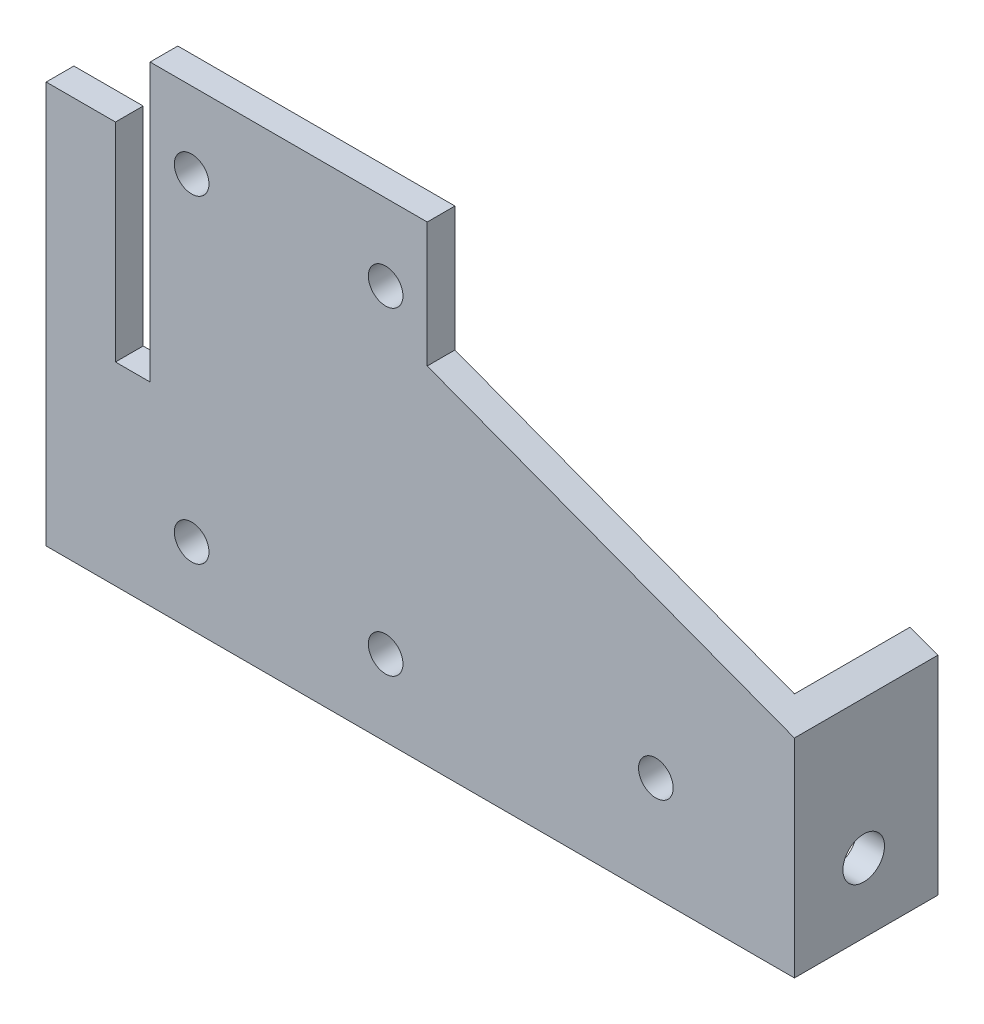
ISO-10303-21;
HEADER;
FILE_DESCRIPTION(('STEP AP214'),'2;1');
FILE_NAME('part.step','',(''),(''),'','','');
FILE_SCHEMA(('AUTOMOTIVE_DESIGN { 1 0 10303 214 1 1 1 1 }'));
ENDSEC;
DATA;
#1=APPLICATION_CONTEXT('core data for automotive mechanical design processes');
#2=APPLICATION_PROTOCOL_DEFINITION('international standard','automotive_design',2000,#1);
#3=PRODUCT_CONTEXT('',#1,'mechanical');
#4=PRODUCT('Part','Part','',(#3));
#5=PRODUCT_RELATED_PRODUCT_CATEGORY('part','',(#4));
#6=PRODUCT_DEFINITION_FORMATION('','',#4);
#7=PRODUCT_DEFINITION_CONTEXT('part definition',#1,'design');
#8=PRODUCT_DEFINITION('design','',#6,#7);
#9=PRODUCT_DEFINITION_SHAPE('','',#8);
#10=(LENGTH_UNIT() NAMED_UNIT(*) SI_UNIT(.MILLI.,.METRE.));
#11=(NAMED_UNIT(*) PLANE_ANGLE_UNIT() SI_UNIT($,.RADIAN.));
#12=(NAMED_UNIT(*) SI_UNIT($,.STERADIAN.) SOLID_ANGLE_UNIT());
#13=UNCERTAINTY_MEASURE_WITH_UNIT(LENGTH_MEASURE(1.E-05),#10,'distance_accuracy_value','');
#14=(GEOMETRIC_REPRESENTATION_CONTEXT(3) GLOBAL_UNCERTAINTY_ASSIGNED_CONTEXT((#13)) GLOBAL_UNIT_ASSIGNED_CONTEXT((#10,
#11,#12)) REPRESENTATION_CONTEXT('',''));
#15=CARTESIAN_POINT('',(0.,0.,0.));
#16=DIRECTION('',(0.,0.,1.));
#17=DIRECTION('',(1.,0.,0.));
#18=AXIS2_PLACEMENT_3D('',#15,#16,#17);
#19=CARTESIAN_POINT('',(0.,0.,4.));
#20=DIRECTION('',(0.,0.,-1.));
#21=DIRECTION('',(-1.,0.,0.));
#22=AXIS2_PLACEMENT_3D('',#19,#20,#21);
#23=PLANE('',#22);
#24=DIRECTION('',(0.,1.,0.));
#25=VECTOR('',#24,1.);
#26=CARTESIAN_POINT('',(9.99999999999999,0.,4.));
#27=LINE('',#26,#25);
#28=CARTESIAN_POINT('',(9.99999999999999,28.,4.));
#29=VERTEX_POINT('',#28);
#30=CARTESIAN_POINT('',(10.,58.,4.));
#31=VERTEX_POINT('',#30);
#32=EDGE_CURVE('E174',#29,#31,#27,.T.);
#33=ORIENTED_EDGE('',*,*,#32,.T.);
#34=DIRECTION('',(-1.,0.,0.));
#35=VECTOR('',#34,1.);
#36=CARTESIAN_POINT('',(0.,58.,4.));
#37=LINE('',#36,#35);
#38=CARTESIAN_POINT('',(0.,58.,4.));
#39=VERTEX_POINT('',#38);
#40=EDGE_CURVE('E274',#31,#39,#37,.T.);
#41=ORIENTED_EDGE('',*,*,#40,.T.);
#42=DIRECTION('',(0.,-1.,0.));
#43=VECTOR('',#42,1.);
#44=CARTESIAN_POINT('',(0.,0.,4.));
#45=LINE('',#44,#43);
#46=CARTESIAN_POINT('',(0.,0.,4.));
#47=VERTEX_POINT('',#46);
#48=EDGE_CURVE('E145',#39,#47,#45,.T.);
#49=ORIENTED_EDGE('',*,*,#48,.T.);
#50=DIRECTION('',(1.,0.,0.));
#51=VECTOR('',#50,1.);
#52=CARTESIAN_POINT('',(0.,0.,4.));
#53=LINE('',#52,#51);
#54=CARTESIAN_POINT('',(108.,0.,4.));
#55=VERTEX_POINT('',#54);
#56=EDGE_CURVE('E148',#47,#55,#53,.T.);
#57=ORIENTED_EDGE('',*,*,#56,.T.);
#58=DIRECTION('',(0.,1.,0.));
#59=VECTOR('',#58,1.);
#60=CARTESIAN_POINT('',(108.,0.,4.));
#61=LINE('',#60,#59);
#62=CARTESIAN_POINT('',(108.,30.,4.));
#63=VERTEX_POINT('',#62);
#64=EDGE_CURVE('E227',#55,#63,#61,.T.);
#65=ORIENTED_EDGE('',*,*,#64,.T.);
#66=DIRECTION('',(-0.935601718950742,0.353057252434242,0.));
#67=VECTOR('',#66,1.);
#68=CARTESIAN_POINT('',(108.,30.,4.));
#69=LINE('',#68,#67);
#70=CARTESIAN_POINT('',(55.,50.,4.));
#71=VERTEX_POINT('',#70);
#72=EDGE_CURVE('E229',#63,#71,#69,.T.);
#73=ORIENTED_EDGE('',*,*,#72,.T.);
#74=DIRECTION('',(0.,1.,0.));
#75=VECTOR('',#74,1.);
#76=CARTESIAN_POINT('',(55.,68.,4.));
#77=LINE('',#76,#75);
#78=CARTESIAN_POINT('',(55.,68.,4.));
#79=VERTEX_POINT('',#78);
#80=EDGE_CURVE('E231',#71,#79,#77,.T.);
#81=ORIENTED_EDGE('',*,*,#80,.T.);
#82=DIRECTION('',(-1.,0.,0.));
#83=VECTOR('',#82,1.);
#84=CARTESIAN_POINT('',(0.,68.,4.));
#85=LINE('',#84,#83);
#86=CARTESIAN_POINT('',(15.,68.,4.));
#87=VERTEX_POINT('',#86);
#88=EDGE_CURVE('E156',#79,#87,#85,.T.);
#89=ORIENTED_EDGE('',*,*,#88,.T.);
#90=DIRECTION('',(0.,-1.,0.));
#91=VECTOR('',#90,1.);
#92=CARTESIAN_POINT('',(15.,0.,4.));
#93=LINE('',#92,#91);
#94=CARTESIAN_POINT('',(15.,28.,4.));
#95=VERTEX_POINT('',#94);
#96=EDGE_CURVE('E50',#87,#95,#93,.T.);
#97=ORIENTED_EDGE('',*,*,#96,.T.);
#98=DIRECTION('',(-1.,0.,0.));
#99=VECTOR('',#98,1.);
#100=CARTESIAN_POINT('',(0.,28.,4.));
#101=LINE('',#100,#99);
#102=EDGE_CURVE('E179',#95,#29,#101,.T.);
#103=ORIENTED_EDGE('',*,*,#102,.T.);
#104=EDGE_LOOP('',(#33,#41,#49,#57,#65,#73,#81,#89,#97,#103));
#105=FACE_BOUND('',#104,.T.);
#106=CARTESIAN_POINT('',(21.,57.,4.));
#107=DIRECTION('',(0.,0.,1.));
#108=DIRECTION('',(1.,0.,0.));
#109=AXIS2_PLACEMENT_3D('',#106,#107,#108);
#110=CIRCLE('',#109,2.5);
#111=CARTESIAN_POINT('',(23.5,57.,4.));
#112=VERTEX_POINT('',#111);
#113=EDGE_CURVE('E220',#112,#112,#110,.T.);
#114=ORIENTED_EDGE('',*,*,#113,.F.);
#115=EDGE_LOOP('',(#114));
#116=FACE_BOUND('',#115,.T.);
#117=CARTESIAN_POINT('',(49.,57.,4.));
#118=DIRECTION('',(0.,0.,1.));
#119=DIRECTION('',(1.,0.,0.));
#120=AXIS2_PLACEMENT_3D('',#117,#118,#119);
#121=CIRCLE('',#120,2.5);
#122=CARTESIAN_POINT('',(51.5,57.,4.));
#123=VERTEX_POINT('',#122);
#124=EDGE_CURVE('E214',#123,#123,#121,.T.);
#125=ORIENTED_EDGE('',*,*,#124,.F.);
#126=EDGE_LOOP('',(#125));
#127=FACE_BOUND('',#126,.T.);
#128=CARTESIAN_POINT('',(21.,11.,4.));
#129=DIRECTION('',(0.,0.,1.));
#130=DIRECTION('',(1.,0.,0.));
#131=AXIS2_PLACEMENT_3D('',#128,#129,#130);
#132=CIRCLE('',#131,2.5);
#133=CARTESIAN_POINT('',(23.5,11.,4.));
#134=VERTEX_POINT('',#133);
#135=EDGE_CURVE('E208',#134,#134,#132,.T.);
#136=ORIENTED_EDGE('',*,*,#135,.F.);
#137=EDGE_LOOP('',(#136));
#138=FACE_BOUND('',#137,.T.);
#139=CARTESIAN_POINT('',(49.,11.,4.));
#140=DIRECTION('',(0.,0.,1.));
#141=DIRECTION('',(1.,0.,0.));
#142=AXIS2_PLACEMENT_3D('',#139,#140,#141);
#143=CIRCLE('',#142,2.5);
#144=CARTESIAN_POINT('',(51.5,11.,4.));
#145=VERTEX_POINT('',#144);
#146=EDGE_CURVE('E202',#145,#145,#143,.T.);
#147=ORIENTED_EDGE('',*,*,#146,.F.);
#148=EDGE_LOOP('',(#147));
#149=FACE_BOUND('',#148,.T.);
#150=CARTESIAN_POINT('',(88.,15.,4.));
#151=DIRECTION('',(0.,0.,1.));
#152=DIRECTION('',(1.,0.,0.));
#153=AXIS2_PLACEMENT_3D('',#150,#151,#152);
#154=CIRCLE('',#153,2.5);
#155=CARTESIAN_POINT('',(90.5,15.,4.));
#156=VERTEX_POINT('',#155);
#157=EDGE_CURVE('E196',#156,#156,#154,.T.);
#158=ORIENTED_EDGE('',*,*,#157,.F.);
#159=EDGE_LOOP('',(#158));
#160=FACE_BOUND('',#159,.T.);
#161=ADVANCED_FACE('F35',(#105,#116,#127,#138,#149,#160),#23,.F.);
#162=CARTESIAN_POINT('',(0.,0.,0.));
#163=DIRECTION('',(0.,0.,-1.));
#164=DIRECTION('',(-1.,0.,0.));
#165=AXIS2_PLACEMENT_3D('',#162,#163,#164);
#166=PLANE('',#165);
#167=DIRECTION('',(-1.,0.,0.));
#168=VECTOR('',#167,1.);
#169=CARTESIAN_POINT('',(0.,58.,0.));
#170=LINE('',#169,#168);
#171=CARTESIAN_POINT('',(10.,58.,0.));
#172=VERTEX_POINT('',#171);
#173=CARTESIAN_POINT('',(0.,58.,0.));
#174=VERTEX_POINT('',#173);
#175=EDGE_CURVE('E279',#172,#174,#170,.T.);
#176=ORIENTED_EDGE('',*,*,#175,.F.);
#177=DIRECTION('',(0.,1.,0.));
#178=VECTOR('',#177,1.);
#179=CARTESIAN_POINT('',(10.,58.,0.));
#180=LINE('',#179,#178);
#181=CARTESIAN_POINT('',(9.99999999999999,28.,0.));
#182=VERTEX_POINT('',#181);
#183=EDGE_CURVE('E293',#182,#172,#180,.T.);
#184=ORIENTED_EDGE('',*,*,#183,.F.);
#185=DIRECTION('',(-1.,0.,0.));
#186=VECTOR('',#185,1.);
#187=CARTESIAN_POINT('',(15.,28.,0.));
#188=LINE('',#187,#186);
#189=CARTESIAN_POINT('',(15.,28.,0.));
#190=VERTEX_POINT('',#189);
#191=EDGE_CURVE('E139',#190,#182,#188,.T.);
#192=ORIENTED_EDGE('',*,*,#191,.F.);
#193=DIRECTION('',(0.,-1.,0.));
#194=VECTOR('',#193,1.);
#195=CARTESIAN_POINT('',(15.,48.,0.));
#196=LINE('',#195,#194);
#197=CARTESIAN_POINT('',(15.,68.,0.));
#198=VERTEX_POINT('',#197);
#199=EDGE_CURVE('E124',#198,#190,#196,.T.);
#200=ORIENTED_EDGE('',*,*,#199,.F.);
#201=DIRECTION('',(-1.,0.,0.));
#202=VECTOR('',#201,1.);
#203=CARTESIAN_POINT('',(0.,68.,0.));
#204=LINE('',#203,#202);
#205=CARTESIAN_POINT('',(55.,68.,0.));
#206=VERTEX_POINT('',#205);
#207=EDGE_CURVE('E136',#206,#198,#204,.T.);
#208=ORIENTED_EDGE('',*,*,#207,.F.);
#209=DIRECTION('',(0.,1.,0.));
#210=VECTOR('',#209,1.);
#211=CARTESIAN_POINT('',(55.,68.,0.));
#212=LINE('',#211,#210);
#213=CARTESIAN_POINT('',(55.,50.,0.));
#214=VERTEX_POINT('',#213);
#215=EDGE_CURVE('E146',#214,#206,#212,.T.);
#216=ORIENTED_EDGE('',*,*,#215,.F.);
#217=DIRECTION('',(-0.935601718950742,0.353057252434242,0.));
#218=VECTOR('',#217,1.);
#219=CARTESIAN_POINT('',(108.,30.,0.));
#220=LINE('',#219,#218);
#221=CARTESIAN_POINT('',(104.,31.5094339622642,0.));
#222=VERTEX_POINT('',#221);
#223=EDGE_CURVE('E150',#222,#214,#220,.T.);
#224=ORIENTED_EDGE('',*,*,#223,.F.);
#225=DIRECTION('',(0.,1.,0.));
#226=VECTOR('',#225,1.);
#227=CARTESIAN_POINT('',(104.,0.,0.));
#228=LINE('',#227,#226);
#229=CARTESIAN_POINT('',(104.,0.,0.));
#230=VERTEX_POINT('',#229);
#231=EDGE_CURVE('E192',#230,#222,#228,.T.);
#232=ORIENTED_EDGE('',*,*,#231,.F.);
#233=DIRECTION('',(1.,0.,0.));
#234=VECTOR('',#233,1.);
#235=CARTESIAN_POINT('',(0.,0.,0.));
#236=LINE('',#235,#234);
#237=CARTESIAN_POINT('',(0.,0.,0.));
#238=VERTEX_POINT('',#237);
#239=EDGE_CURVE('E235',#238,#230,#236,.T.);
#240=ORIENTED_EDGE('',*,*,#239,.F.);
#241=DIRECTION('',(0.,-1.,0.));
#242=VECTOR('',#241,1.);
#243=CARTESIAN_POINT('',(0.,0.,0.));
#244=LINE('',#243,#242);
#245=EDGE_CURVE('E223',#174,#238,#244,.T.);
#246=ORIENTED_EDGE('',*,*,#245,.F.);
#247=EDGE_LOOP('',(#176,#184,#192,#200,#208,#216,#224,#232,#240,#246));
#248=FACE_BOUND('',#247,.T.);
#249=CARTESIAN_POINT('',(49.,11.,0.));
#250=DIRECTION('',(0.,0.,1.));
#251=DIRECTION('',(1.,0.,0.));
#252=AXIS2_PLACEMENT_3D('',#249,#250,#251);
#253=CIRCLE('',#252,2.5);
#254=CARTESIAN_POINT('',(51.5,11.,0.));
#255=VERTEX_POINT('',#254);
#256=EDGE_CURVE('E199',#255,#255,#253,.T.);
#257=ORIENTED_EDGE('',*,*,#256,.T.);
#258=EDGE_LOOP('',(#257));
#259=FACE_BOUND('',#258,.T.);
#260=CARTESIAN_POINT('',(49.,57.,0.));
#261=DIRECTION('',(0.,0.,1.));
#262=DIRECTION('',(1.,0.,0.));
#263=AXIS2_PLACEMENT_3D('',#260,#261,#262);
#264=CIRCLE('',#263,2.5);
#265=CARTESIAN_POINT('',(51.5,57.,0.));
#266=VERTEX_POINT('',#265);
#267=EDGE_CURVE('E211',#266,#266,#264,.T.);
#268=ORIENTED_EDGE('',*,*,#267,.T.);
#269=EDGE_LOOP('',(#268));
#270=FACE_BOUND('',#269,.T.);
#271=CARTESIAN_POINT('',(21.,57.,0.));
#272=DIRECTION('',(0.,0.,1.));
#273=DIRECTION('',(1.,0.,0.));
#274=AXIS2_PLACEMENT_3D('',#271,#272,#273);
#275=CIRCLE('',#274,2.5);
#276=CARTESIAN_POINT('',(23.5,57.,0.));
#277=VERTEX_POINT('',#276);
#278=EDGE_CURVE('E217',#277,#277,#275,.T.);
#279=ORIENTED_EDGE('',*,*,#278,.T.);
#280=EDGE_LOOP('',(#279));
#281=FACE_BOUND('',#280,.T.);
#282=CARTESIAN_POINT('',(21.,11.,0.));
#283=DIRECTION('',(0.,0.,1.));
#284=DIRECTION('',(1.,0.,0.));
#285=AXIS2_PLACEMENT_3D('',#282,#283,#284);
#286=CIRCLE('',#285,2.5);
#287=CARTESIAN_POINT('',(23.5,11.,0.));
#288=VERTEX_POINT('',#287);
#289=EDGE_CURVE('E205',#288,#288,#286,.T.);
#290=ORIENTED_EDGE('',*,*,#289,.T.);
#291=EDGE_LOOP('',(#290));
#292=FACE_BOUND('',#291,.T.);
#293=CARTESIAN_POINT('',(88.,15.,0.));
#294=DIRECTION('',(0.,0.,1.));
#295=DIRECTION('',(1.,0.,0.));
#296=AXIS2_PLACEMENT_3D('',#293,#294,#295);
#297=CIRCLE('',#296,2.5);
#298=CARTESIAN_POINT('',(90.5,15.,0.));
#299=VERTEX_POINT('',#298);
#300=EDGE_CURVE('E195',#299,#299,#297,.T.);
#301=ORIENTED_EDGE('',*,*,#300,.T.);
#302=EDGE_LOOP('',(#301));
#303=FACE_BOUND('',#302,.T.);
#304=ADVANCED_FACE('F133',(#248,#259,#270,#281,#292,#303),#166,.T.);
#305=CARTESIAN_POINT('',(0.,0.,4.));
#306=DIRECTION('',(1.,0.,0.));
#307=DIRECTION('',(0.,0.,-1.));
#308=AXIS2_PLACEMENT_3D('',#305,#306,#307);
#309=PLANE('',#308);
#310=ORIENTED_EDGE('',*,*,#48,.F.);
#311=DIRECTION('',(0.,0.,-1.));
#312=VECTOR('',#311,1.);
#313=CARTESIAN_POINT('',(0.,58.,10.));
#314=LINE('',#313,#312);
#315=EDGE_CURVE('E269',#39,#174,#314,.T.);
#316=ORIENTED_EDGE('',*,*,#315,.T.);
#317=ORIENTED_EDGE('',*,*,#245,.T.);
#318=DIRECTION('',(0.,0.,-1.));
#319=VECTOR('',#318,1.);
#320=CARTESIAN_POINT('',(0.,0.,4.));
#321=LINE('',#320,#319);
#322=EDGE_CURVE('E43',#47,#238,#321,.T.);
#323=ORIENTED_EDGE('',*,*,#322,.F.);
#324=EDGE_LOOP('',(#310,#316,#317,#323));
#325=FACE_BOUND('',#324,.T.);
#326=ADVANCED_FACE('F37',(#325),#309,.F.);
#327=CARTESIAN_POINT('',(0.,0.,4.));
#328=DIRECTION('',(0.,1.,0.));
#329=DIRECTION('',(0.,0.,1.));
#330=AXIS2_PLACEMENT_3D('',#327,#328,#329);
#331=PLANE('',#330);
#332=ORIENTED_EDGE('',*,*,#239,.T.);
#333=DIRECTION('',(0.,0.,1.));
#334=VECTOR('',#333,1.);
#335=CARTESIAN_POINT('',(104.,0.,-16.7));
#336=LINE('',#335,#334);
#337=CARTESIAN_POINT('',(104.,0.,-16.7));
#338=VERTEX_POINT('',#337);
#339=EDGE_CURVE('E190',#338,#230,#336,.T.);
#340=ORIENTED_EDGE('',*,*,#339,.F.);
#341=DIRECTION('',(1.,0.,0.));
#342=VECTOR('',#341,1.);
#343=CARTESIAN_POINT('',(108.,0.,-16.7));
#344=LINE('',#343,#342);
#345=CARTESIAN_POINT('',(108.,0.,-16.7));
#346=VERTEX_POINT('',#345);
#347=EDGE_CURVE('E187',#338,#346,#344,.T.);
#348=ORIENTED_EDGE('',*,*,#347,.T.);
#349=DIRECTION('',(0.,0.,-1.));
#350=VECTOR('',#349,1.);
#351=CARTESIAN_POINT('',(108.,0.,4.));
#352=LINE('',#351,#350);
#353=EDGE_CURVE('E161',#55,#346,#352,.T.);
#354=ORIENTED_EDGE('',*,*,#353,.F.);
#355=ORIENTED_EDGE('',*,*,#56,.F.);
#356=ORIENTED_EDGE('',*,*,#322,.T.);
#357=EDGE_LOOP('',(#332,#340,#348,#354,#355,#356));
#358=FACE_BOUND('',#357,.T.);
#359=ADVANCED_FACE('F260',(#358),#331,.F.);
#360=CARTESIAN_POINT('',(108.,0.,4.));
#361=DIRECTION('',(-1.,0.,0.));
#362=DIRECTION('',(0.,0.,1.));
#363=AXIS2_PLACEMENT_3D('',#360,#361,#362);
#364=PLANE('',#363);
#365=CARTESIAN_POINT('',(108.,10.,-6.));
#366=DIRECTION('',(1.,0.,0.));
#367=DIRECTION('',(0.,0.,-1.));
#368=AXIS2_PLACEMENT_3D('',#365,#366,#367);
#369=CIRCLE('',#368,3.);
#370=CARTESIAN_POINT('',(108.,10.,-9.));
#371=VERTEX_POINT('',#370);
#372=EDGE_CURVE('E167',#371,#371,#369,.T.);
#373=ORIENTED_EDGE('',*,*,#372,.F.);
#374=EDGE_LOOP('',(#373));
#375=FACE_BOUND('',#374,.T.);
#376=ORIENTED_EDGE('',*,*,#353,.T.);
#377=DIRECTION('',(0.,1.,0.));
#378=VECTOR('',#377,1.);
#379=CARTESIAN_POINT('',(108.,30.,-16.7));
#380=LINE('',#379,#378);
#381=CARTESIAN_POINT('',(108.,30.,-16.7));
#382=VERTEX_POINT('',#381);
#383=EDGE_CURVE('E166',#346,#382,#380,.T.);
#384=ORIENTED_EDGE('',*,*,#383,.T.);
#385=DIRECTION('',(0.,0.,-1.));
#386=VECTOR('',#385,1.);
#387=CARTESIAN_POINT('',(108.,30.,4.));
#388=LINE('',#387,#386);
#389=EDGE_CURVE('E159',#63,#382,#388,.T.);
#390=ORIENTED_EDGE('',*,*,#389,.F.);
#391=ORIENTED_EDGE('',*,*,#64,.F.);
#392=EDGE_LOOP('',(#376,#384,#390,#391));
#393=FACE_BOUND('',#392,.T.);
#394=ADVANCED_FACE('F256',(#375,#393),#364,.F.);
#395=CARTESIAN_POINT('',(108.,30.,4.));
#396=DIRECTION('',(-0.353057252434242,-0.935601718950742,0.));
#397=DIRECTION('',(0.935601718950742,-0.353057252434242,0.));
#398=AXIS2_PLACEMENT_3D('',#395,#396,#397);
#399=PLANE('',#398);
#400=DIRECTION('',(0.,0.,-1.));
#401=VECTOR('',#400,1.);
#402=CARTESIAN_POINT('',(55.,50.,4.));
#403=LINE('',#402,#401);
#404=EDGE_CURVE('E155',#71,#214,#403,.T.);
#405=ORIENTED_EDGE('',*,*,#404,.F.);
#406=ORIENTED_EDGE('',*,*,#72,.F.);
#407=ORIENTED_EDGE('',*,*,#389,.T.);
#408=DIRECTION('',(-0.935601718950742,0.353057252434242,0.));
#409=VECTOR('',#408,1.);
#410=CARTESIAN_POINT('',(104.,31.5094339622642,-16.7));
#411=LINE('',#410,#409);
#412=CARTESIAN_POINT('',(104.,31.5094339622642,-16.7));
#413=VERTEX_POINT('',#412);
#414=EDGE_CURVE('E171',#382,#413,#411,.T.);
#415=ORIENTED_EDGE('',*,*,#414,.T.);
#416=DIRECTION('',(0.,0.,1.));
#417=VECTOR('',#416,1.);
#418=CARTESIAN_POINT('',(104.,31.5094339622642,-16.7));
#419=LINE('',#418,#417);
#420=EDGE_CURVE('E57',#413,#222,#419,.T.);
#421=ORIENTED_EDGE('',*,*,#420,.T.);
#422=ORIENTED_EDGE('',*,*,#223,.T.);
#423=EDGE_LOOP('',(#405,#406,#407,#415,#421,#422));
#424=FACE_BOUND('',#423,.T.);
#425=ADVANCED_FACE('F239',(#424),#399,.F.);
#426=CARTESIAN_POINT('',(55.,68.,4.));
#427=DIRECTION('',(-1.,0.,0.));
#428=DIRECTION('',(0.,-1.,0.));
#429=AXIS2_PLACEMENT_3D('',#426,#427,#428);
#430=PLANE('',#429);
#431=ORIENTED_EDGE('',*,*,#215,.T.);
#432=DIRECTION('',(0.,0.,-1.));
#433=VECTOR('',#432,1.);
#434=CARTESIAN_POINT('',(55.,68.,4.));
#435=LINE('',#434,#433);
#436=EDGE_CURVE('E144',#79,#206,#435,.T.);
#437=ORIENTED_EDGE('',*,*,#436,.F.);
#438=ORIENTED_EDGE('',*,*,#80,.F.);
#439=ORIENTED_EDGE('',*,*,#404,.T.);
#440=EDGE_LOOP('',(#431,#437,#438,#439));
#441=FACE_BOUND('',#440,.T.);
#442=ADVANCED_FACE('F244',(#441),#430,.F.);
#443=CARTESIAN_POINT('',(0.,68.,4.));
#444=DIRECTION('',(0.,-1.,0.));
#445=DIRECTION('',(0.,0.,-1.));
#446=AXIS2_PLACEMENT_3D('',#443,#444,#445);
#447=PLANE('',#446);
#448=ORIENTED_EDGE('',*,*,#207,.T.);
#449=DIRECTION('',(0.,0.,1.));
#450=VECTOR('',#449,1.);
#451=CARTESIAN_POINT('',(15.,68.,4.));
#452=LINE('',#451,#450);
#453=EDGE_CURVE('E11',#198,#87,#452,.T.);
#454=ORIENTED_EDGE('',*,*,#453,.T.);
#455=ORIENTED_EDGE('',*,*,#88,.F.);
#456=ORIENTED_EDGE('',*,*,#436,.T.);
#457=EDGE_LOOP('',(#448,#454,#455,#456));
#458=FACE_BOUND('',#457,.T.);
#459=ADVANCED_FACE('F142',(#458),#447,.F.);
#460=CARTESIAN_POINT('',(21.,57.,4.));
#461=DIRECTION('',(0.,0.,-1.));
#462=DIRECTION('',(-1.,0.,0.));
#463=AXIS2_PLACEMENT_3D('',#460,#461,#462);
#464=CYLINDRICAL_SURFACE('',#463,2.5);
#465=ORIENTED_EDGE('',*,*,#113,.T.);
#466=EDGE_LOOP('',(#465));
#467=FACE_BOUND('',#466,.T.);
#468=ORIENTED_EDGE('',*,*,#278,.F.);
#469=EDGE_LOOP('',(#468));
#470=FACE_BOUND('',#469,.T.);
#471=ADVANCED_FACE('F312',(#467,#470),#464,.F.);
#472=CARTESIAN_POINT('',(49.,57.,4.));
#473=DIRECTION('',(0.,0.,-1.));
#474=DIRECTION('',(-1.,0.,0.));
#475=AXIS2_PLACEMENT_3D('',#472,#473,#474);
#476=CYLINDRICAL_SURFACE('',#475,2.5);
#477=ORIENTED_EDGE('',*,*,#124,.T.);
#478=EDGE_LOOP('',(#477));
#479=FACE_BOUND('',#478,.T.);
#480=ORIENTED_EDGE('',*,*,#267,.F.);
#481=EDGE_LOOP('',(#480));
#482=FACE_BOUND('',#481,.T.);
#483=ADVANCED_FACE('F415',(#479,#482),#476,.F.);
#484=CARTESIAN_POINT('',(21.,11.,4.));
#485=DIRECTION('',(0.,0.,-1.));
#486=DIRECTION('',(-1.,0.,0.));
#487=AXIS2_PLACEMENT_3D('',#484,#485,#486);
#488=CYLINDRICAL_SURFACE('',#487,2.5);
#489=ORIENTED_EDGE('',*,*,#135,.T.);
#490=EDGE_LOOP('',(#489));
#491=FACE_BOUND('',#490,.T.);
#492=ORIENTED_EDGE('',*,*,#289,.F.);
#493=EDGE_LOOP('',(#492));
#494=FACE_BOUND('',#493,.T.);
#495=ADVANCED_FACE('F405',(#491,#494),#488,.F.);
#496=CARTESIAN_POINT('',(49.,11.,4.));
#497=DIRECTION('',(0.,0.,-1.));
#498=DIRECTION('',(-1.,0.,0.));
#499=AXIS2_PLACEMENT_3D('',#496,#497,#498);
#500=CYLINDRICAL_SURFACE('',#499,2.5);
#501=ORIENTED_EDGE('',*,*,#146,.T.);
#502=EDGE_LOOP('',(#501));
#503=FACE_BOUND('',#502,.T.);
#504=ORIENTED_EDGE('',*,*,#256,.F.);
#505=EDGE_LOOP('',(#504));
#506=FACE_BOUND('',#505,.T.);
#507=ADVANCED_FACE('F395',(#503,#506),#500,.F.);
#508=CARTESIAN_POINT('',(88.,15.,4.));
#509=DIRECTION('',(0.,0.,-1.));
#510=DIRECTION('',(-1.,0.,0.));
#511=AXIS2_PLACEMENT_3D('',#508,#509,#510);
#512=CYLINDRICAL_SURFACE('',#511,2.5);
#513=ORIENTED_EDGE('',*,*,#157,.T.);
#514=EDGE_LOOP('',(#513));
#515=FACE_BOUND('',#514,.T.);
#516=ORIENTED_EDGE('',*,*,#300,.F.);
#517=EDGE_LOOP('',(#516));
#518=FACE_BOUND('',#517,.T.);
#519=ADVANCED_FACE('F360',(#515,#518),#512,.F.);
#520=CARTESIAN_POINT('',(104.,0.,-16.7));
#521=DIRECTION('',(-1.,0.,0.));
#522=DIRECTION('',(0.,0.,1.));
#523=AXIS2_PLACEMENT_3D('',#520,#521,#522);
#524=PLANE('',#523);
#525=CARTESIAN_POINT('',(104.,10.,-6.));
#526=DIRECTION('',(-1.,0.,0.));
#527=DIRECTION('',(0.,0.,1.));
#528=AXIS2_PLACEMENT_3D('',#525,#526,#527);
#529=CIRCLE('',#528,3.);
#530=CARTESIAN_POINT('',(104.,10.,-3.));
#531=VERTEX_POINT('',#530);
#532=EDGE_CURVE('E164',#531,#531,#529,.T.);
#533=ORIENTED_EDGE('',*,*,#532,.F.);
#534=EDGE_LOOP('',(#533));
#535=FACE_BOUND('',#534,.T.);
#536=ORIENTED_EDGE('',*,*,#339,.T.);
#537=ORIENTED_EDGE('',*,*,#231,.T.);
#538=ORIENTED_EDGE('',*,*,#420,.F.);
#539=DIRECTION('',(0.,-1.,0.));
#540=VECTOR('',#539,1.);
#541=CARTESIAN_POINT('',(104.,0.,-16.7));
#542=LINE('',#541,#540);
#543=EDGE_CURVE('E184',#413,#338,#542,.T.);
#544=ORIENTED_EDGE('',*,*,#543,.T.);
#545=EDGE_LOOP('',(#536,#537,#538,#544));
#546=FACE_BOUND('',#545,.T.);
#547=ADVANCED_FACE('F264',(#535,#546),#524,.T.);
#548=CARTESIAN_POINT('',(0.,0.,-16.7));
#549=DIRECTION('',(0.,0.,-1.));
#550=DIRECTION('',(-1.,0.,0.));
#551=AXIS2_PLACEMENT_3D('',#548,#549,#550);
#552=PLANE('',#551);
#553=ORIENTED_EDGE('',*,*,#383,.F.);
#554=ORIENTED_EDGE('',*,*,#347,.F.);
#555=ORIENTED_EDGE('',*,*,#543,.F.);
#556=ORIENTED_EDGE('',*,*,#414,.F.);
#557=EDGE_LOOP('',(#553,#554,#555,#556));
#558=FACE_BOUND('',#557,.T.);
#559=ADVANCED_FACE('F254',(#558),#552,.T.);
#560=CARTESIAN_POINT('',(101.3,10.,-6.));
#561=DIRECTION('',(1.,0.,0.));
#562=DIRECTION('',(0.,0.,-1.));
#563=AXIS2_PLACEMENT_3D('',#560,#561,#562);
#564=CYLINDRICAL_SURFACE('',#563,3.);
#565=ORIENTED_EDGE('',*,*,#532,.T.);
#566=EDGE_LOOP('',(#565));
#567=FACE_BOUND('',#566,.T.);
#568=ORIENTED_EDGE('',*,*,#372,.T.);
#569=EDGE_LOOP('',(#568));
#570=FACE_BOUND('',#569,.T.);
#571=ADVANCED_FACE('F343',(#567,#570),#564,.F.);
#572=CARTESIAN_POINT('',(10.,58.,10.));
#573=DIRECTION('',(-1.,0.,0.));
#574=DIRECTION('',(0.,-1.,0.));
#575=AXIS2_PLACEMENT_3D('',#572,#573,#574);
#576=PLANE('',#575);
#577=DIRECTION('',(0.,0.,-1.));
#578=VECTOR('',#577,1.);
#579=CARTESIAN_POINT('',(9.99999999999999,28.,10.));
#580=LINE('',#579,#578);
#581=EDGE_CURVE('E276',#29,#182,#580,.T.);
#582=ORIENTED_EDGE('',*,*,#581,.T.);
#583=ORIENTED_EDGE('',*,*,#183,.T.);
#584=DIRECTION('',(0.,0.,-1.));
#585=VECTOR('',#584,1.);
#586=CARTESIAN_POINT('',(10.,58.,10.));
#587=LINE('',#586,#585);
#588=EDGE_CURVE('E272',#31,#172,#587,.T.);
#589=ORIENTED_EDGE('',*,*,#588,.F.);
#590=ORIENTED_EDGE('',*,*,#32,.F.);
#591=EDGE_LOOP('',(#582,#583,#589,#590));
#592=FACE_BOUND('',#591,.T.);
#593=ADVANCED_FACE('F291',(#592),#576,.F.);
#594=CARTESIAN_POINT('',(15.,28.,10.));
#595=DIRECTION('',(0.,-1.,0.));
#596=DIRECTION('',(1.,0.,0.));
#597=AXIS2_PLACEMENT_3D('',#594,#595,#596);
#598=PLANE('',#597);
#599=DIRECTION('',(0.,0.,-1.));
#600=VECTOR('',#599,1.);
#601=CARTESIAN_POINT('',(15.,28.,10.));
#602=LINE('',#601,#600);
#603=EDGE_CURVE('E283',#95,#190,#602,.T.);
#604=ORIENTED_EDGE('',*,*,#603,.T.);
#605=ORIENTED_EDGE('',*,*,#191,.T.);
#606=ORIENTED_EDGE('',*,*,#581,.F.);
#607=ORIENTED_EDGE('',*,*,#102,.F.);
#608=EDGE_LOOP('',(#604,#605,#606,#607));
#609=FACE_BOUND('',#608,.T.);
#610=ADVANCED_FACE('F288',(#609),#598,.F.);
#611=CARTESIAN_POINT('',(0.,58.,10.));
#612=DIRECTION('',(0.,-1.,0.));
#613=DIRECTION('',(0.,0.,-1.));
#614=AXIS2_PLACEMENT_3D('',#611,#612,#613);
#615=PLANE('',#614);
#616=ORIENTED_EDGE('',*,*,#588,.T.);
#617=ORIENTED_EDGE('',*,*,#175,.T.);
#618=ORIENTED_EDGE('',*,*,#315,.F.);
#619=ORIENTED_EDGE('',*,*,#40,.F.);
#620=EDGE_LOOP('',(#616,#617,#618,#619));
#621=FACE_BOUND('',#620,.T.);
#622=ADVANCED_FACE('F294',(#621),#615,.F.);
#623=CARTESIAN_POINT('',(15.,48.,10.));
#624=DIRECTION('',(1.,0.,0.));
#625=DIRECTION('',(0.,1.,0.));
#626=AXIS2_PLACEMENT_3D('',#623,#624,#625);
#627=PLANE('',#626);
#628=ORIENTED_EDGE('',*,*,#453,.F.);
#629=ORIENTED_EDGE('',*,*,#199,.T.);
#630=ORIENTED_EDGE('',*,*,#603,.F.);
#631=ORIENTED_EDGE('',*,*,#96,.F.);
#632=EDGE_LOOP('',(#628,#629,#630,#631));
#633=FACE_BOUND('',#632,.T.);
#634=ADVANCED_FACE('F123',(#633),#627,.F.);
#635=CLOSED_SHELL('',(#161,#304,#326,#359,#394,#425,#442,#459,#471,#483,#495,#507,#519,#547,
#559,#571,#593,#610,#622,#634));
#636=MANIFOLD_SOLID_BREP('B2',#635);
#637=ADVANCED_BREP_SHAPE_REPRESENTATION('',(#18,#636),#14);
#638=SHAPE_DEFINITION_REPRESENTATION(#9,#637);
ENDSEC;
END-ISO-10303-21;
